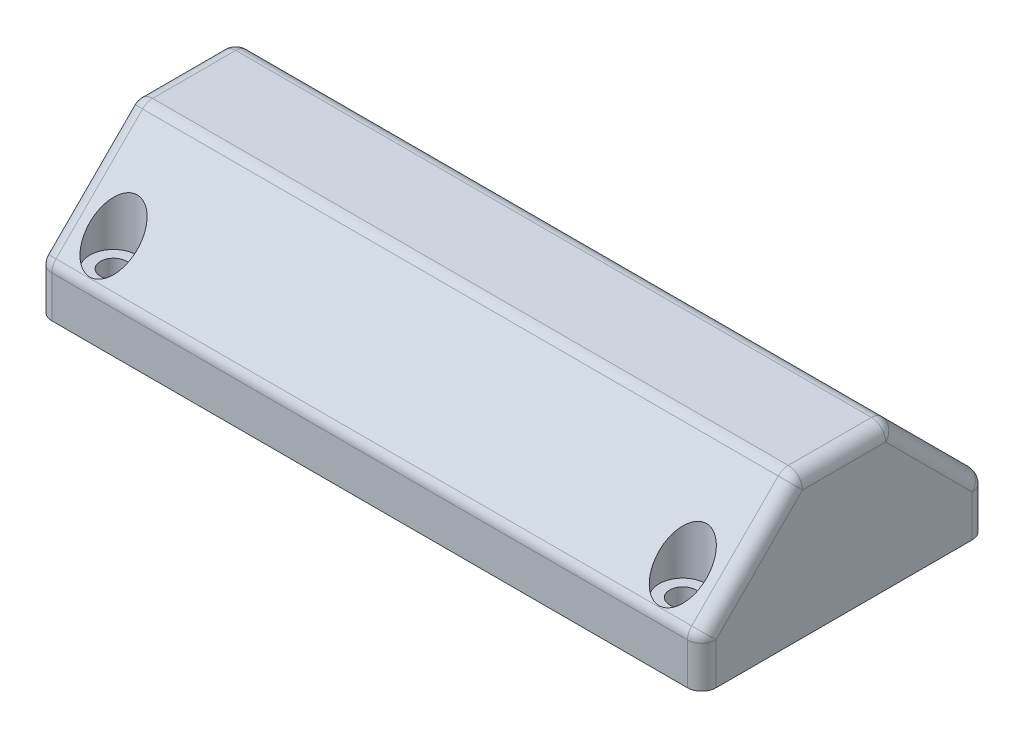
ISO-10303-21;
HEADER;
FILE_DESCRIPTION(('STEP AP214'),'2;1');
FILE_NAME('part.step','',(''),(''),'','','');
FILE_SCHEMA(('AUTOMOTIVE_DESIGN { 1 0 10303 214 1 1 1 1 }'));
ENDSEC;
DATA;
#1=APPLICATION_CONTEXT('core data for automotive mechanical design processes');
#2=APPLICATION_PROTOCOL_DEFINITION('international standard','automotive_design',2000,#1);
#3=PRODUCT_CONTEXT('',#1,'mechanical');
#4=PRODUCT('Part','Part','',(#3));
#5=PRODUCT_RELATED_PRODUCT_CATEGORY('part','',(#4));
#6=PRODUCT_DEFINITION_FORMATION('','',#4);
#7=PRODUCT_DEFINITION_CONTEXT('part definition',#1,'design');
#8=PRODUCT_DEFINITION('design','',#6,#7);
#9=PRODUCT_DEFINITION_SHAPE('','',#8);
#10=(LENGTH_UNIT() NAMED_UNIT(*) SI_UNIT(.MILLI.,.METRE.));
#11=(NAMED_UNIT(*) PLANE_ANGLE_UNIT() SI_UNIT($,.RADIAN.));
#12=(NAMED_UNIT(*) SI_UNIT($,.STERADIAN.) SOLID_ANGLE_UNIT());
#13=UNCERTAINTY_MEASURE_WITH_UNIT(LENGTH_MEASURE(1.E-05),#10,'distance_accuracy_value','');
#14=(GEOMETRIC_REPRESENTATION_CONTEXT(3) GLOBAL_UNCERTAINTY_ASSIGNED_CONTEXT((#13)) GLOBAL_UNIT_ASSIGNED_CONTEXT((#10,
#11,#12)) REPRESENTATION_CONTEXT('',''));
#15=CARTESIAN_POINT('',(0.,0.,0.));
#16=DIRECTION('',(0.,0.,1.));
#17=DIRECTION('',(1.,0.,0.));
#18=AXIS2_PLACEMENT_3D('',#15,#16,#17);
#19=CARTESIAN_POINT('',(70.,10.,0.));
#20=DIRECTION('',(1.,0.,0.));
#21=DIRECTION('',(0.,0.,-1.));
#22=AXIS2_PLACEMENT_3D('',#19,#20,#21);
#23=PLANE('',#22);
#24=DIRECTION('',(0.,-0.707106781186548,0.707106781186548));
#25=VECTOR('',#24,1.);
#26=CARTESIAN_POINT('',(70.,7.87867965644036,27.8786796564403));
#27=LINE('',#26,#25);
#28=CARTESIAN_POINT('',(70.,27.,8.75735931288071));
#29=VERTEX_POINT('',#28);
#30=CARTESIAN_POINT('',(70.,8.75735931288071,27.));
#31=VERTEX_POINT('',#30);
#32=EDGE_CURVE('E211',#29,#31,#27,.T.);
#33=ORIENTED_EDGE('',*,*,#32,.T.);
#34=DIRECTION('',(0.,-1.,0.));
#35=VECTOR('',#34,1.);
#36=CARTESIAN_POINT('',(70.,0.,27.));
#37=LINE('',#36,#35);
#38=CARTESIAN_POINT('',(70.,0.,27.));
#39=VERTEX_POINT('',#38);
#40=EDGE_CURVE('E213',#31,#39,#37,.T.);
#41=ORIENTED_EDGE('',*,*,#40,.T.);
#42=DIRECTION('',(0.,0.,1.));
#43=VECTOR('',#42,1.);
#44=CARTESIAN_POINT('',(70.,0.,0.));
#45=LINE('',#44,#43);
#46=CARTESIAN_POINT('',(70.,0.,-27.));
#47=VERTEX_POINT('',#46);
#48=EDGE_CURVE('E333',#47,#39,#45,.T.);
#49=ORIENTED_EDGE('',*,*,#48,.F.);
#50=DIRECTION('',(0.,-1.,0.));
#51=VECTOR('',#50,1.);
#52=CARTESIAN_POINT('',(70.,9.99999999999999,-27.));
#53=LINE('',#52,#51);
#54=CARTESIAN_POINT('',(70.,8.7573593128807,-27.));
#55=VERTEX_POINT('',#54);
#56=EDGE_CURVE('E205',#47,#55,#53,.F.);
#57=ORIENTED_EDGE('',*,*,#56,.T.);
#58=DIRECTION('',(0.,0.707106781186548,0.707106781186547));
#59=VECTOR('',#58,1.);
#60=CARTESIAN_POINT('',(70.,27.8786796564404,-7.87867965644036));
#61=LINE('',#60,#59);
#62=CARTESIAN_POINT('',(70.,27.,-8.75735931288071));
#63=VERTEX_POINT('',#62);
#64=EDGE_CURVE('E207',#55,#63,#61,.T.);
#65=ORIENTED_EDGE('',*,*,#64,.T.);
#66=DIRECTION('',(0.,0.,-1.));
#67=VECTOR('',#66,1.);
#68=CARTESIAN_POINT('',(70.,27.,0.));
#69=LINE('',#68,#67);
#70=EDGE_CURVE('E209',#63,#29,#69,.F.);
#71=ORIENTED_EDGE('',*,*,#70,.T.);
#72=EDGE_LOOP('',(#33,#41,#49,#57,#65,#71));
#73=FACE_BOUND('',#72,.T.);
#74=ADVANCED_FACE('F37',(#73),#23,.T.);
#75=CARTESIAN_POINT('',(0.,9.99999999999999,-30.));
#76=DIRECTION('',(0.,0.,1.));
#77=DIRECTION('',(0.,-1.,0.));
#78=AXIS2_PLACEMENT_3D('',#75,#76,#77);
#79=PLANE('',#78);
#80=DIRECTION('',(-1.,0.,0.));
#81=VECTOR('',#80,1.);
#82=CARTESIAN_POINT('',(0.,8.7573593128807,-30.));
#83=LINE('',#82,#81);
#84=CARTESIAN_POINT('',(-67.,8.75735931288071,-30.));
#85=VERTEX_POINT('',#84);
#86=CARTESIAN_POINT('',(67.,8.75735931288069,-30.));
#87=VERTEX_POINT('',#86);
#88=EDGE_CURVE('E234',#85,#87,#83,.F.);
#89=ORIENTED_EDGE('',*,*,#88,.T.);
#90=DIRECTION('',(0.,-1.,0.));
#91=VECTOR('',#90,1.);
#92=CARTESIAN_POINT('',(67.,0.,-30.));
#93=LINE('',#92,#91);
#94=CARTESIAN_POINT('',(67.,0.,-30.));
#95=VERTEX_POINT('',#94);
#96=EDGE_CURVE('E236',#87,#95,#93,.T.);
#97=ORIENTED_EDGE('',*,*,#96,.T.);
#98=DIRECTION('',(-1.,0.,0.));
#99=VECTOR('',#98,1.);
#100=CARTESIAN_POINT('',(0.,0.,-30.));
#101=LINE('',#100,#99);
#102=CARTESIAN_POINT('',(-67.,0.,-30.));
#103=VERTEX_POINT('',#102);
#104=EDGE_CURVE('E336',#95,#103,#101,.T.);
#105=ORIENTED_EDGE('',*,*,#104,.T.);
#106=DIRECTION('',(0.,-1.,0.));
#107=VECTOR('',#106,1.);
#108=CARTESIAN_POINT('',(-67.,9.99999999999999,-30.));
#109=LINE('',#108,#107);
#110=EDGE_CURVE('E232',#103,#85,#109,.F.);
#111=ORIENTED_EDGE('',*,*,#110,.T.);
#112=EDGE_LOOP('',(#89,#97,#105,#111));
#113=FACE_BOUND('',#112,.T.);
#114=ADVANCED_FACE('F383',(#113),#79,.F.);
#115=CARTESIAN_POINT('',(-70.,10.,0.));
#116=DIRECTION('',(1.,0.,0.));
#117=DIRECTION('',(0.,0.,-1.));
#118=AXIS2_PLACEMENT_3D('',#115,#116,#117);
#119=PLANE('',#118);
#120=DIRECTION('',(0.,0.,1.));
#121=VECTOR('',#120,1.);
#122=CARTESIAN_POINT('',(-70.,0.,0.));
#123=LINE('',#122,#121);
#124=CARTESIAN_POINT('',(-70.,0.,-27.));
#125=VERTEX_POINT('',#124);
#126=CARTESIAN_POINT('',(-70.,0.,27.));
#127=VERTEX_POINT('',#126);
#128=EDGE_CURVE('E339',#125,#127,#123,.T.);
#129=ORIENTED_EDGE('',*,*,#128,.T.);
#130=DIRECTION('',(0.,-1.,0.));
#131=VECTOR('',#130,1.);
#132=CARTESIAN_POINT('',(-70.,10.,27.));
#133=LINE('',#132,#131);
#134=CARTESIAN_POINT('',(-70.,8.75735931288071,27.));
#135=VERTEX_POINT('',#134);
#136=EDGE_CURVE('E54',#127,#135,#133,.F.);
#137=ORIENTED_EDGE('',*,*,#136,.T.);
#138=DIRECTION('',(0.,-0.707106781186548,0.707106781186548));
#139=VECTOR('',#138,1.);
#140=CARTESIAN_POINT('',(-70.,22.8786796564404,12.8786796564403));
#141=LINE('',#140,#139);
#142=CARTESIAN_POINT('',(-70.,27.,8.75735931288071));
#143=VERTEX_POINT('',#142);
#144=EDGE_CURVE('E58',#135,#143,#141,.F.);
#145=ORIENTED_EDGE('',*,*,#144,.T.);
#146=DIRECTION('',(0.,0.,-1.));
#147=VECTOR('',#146,1.);
#148=CARTESIAN_POINT('',(-70.,27.,-10.));
#149=LINE('',#148,#147);
#150=CARTESIAN_POINT('',(-70.,27.,-8.75735931288071));
#151=VERTEX_POINT('',#150);
#152=EDGE_CURVE('E242',#143,#151,#149,.T.);
#153=ORIENTED_EDGE('',*,*,#152,.T.);
#154=DIRECTION('',(0.,0.707106781186548,0.707106781186547));
#155=VECTOR('',#154,1.);
#156=CARTESIAN_POINT('',(-70.,22.8786796564403,-12.8786796564403));
#157=LINE('',#156,#155);
#158=CARTESIAN_POINT('',(-70.,8.75735931288071,-27.));
#159=VERTEX_POINT('',#158);
#160=EDGE_CURVE('E240',#151,#159,#157,.F.);
#161=ORIENTED_EDGE('',*,*,#160,.T.);
#162=DIRECTION('',(0.,-1.,0.));
#163=VECTOR('',#162,1.);
#164=CARTESIAN_POINT('',(-70.,9.99999999999999,-27.));
#165=LINE('',#164,#163);
#166=EDGE_CURVE('E238',#159,#125,#165,.T.);
#167=ORIENTED_EDGE('',*,*,#166,.T.);
#168=EDGE_LOOP('',(#129,#137,#145,#153,#161,#167));
#169=FACE_BOUND('',#168,.T.);
#170=ADVANCED_FACE('F389',(#169),#119,.F.);
#171=CARTESIAN_POINT('',(60.,10.,24.));
#172=DIRECTION('',(0.,-1.,0.));
#173=DIRECTION('',(0.,0.,-1.));
#174=AXIS2_PLACEMENT_3D('',#171,#172,#173);
#175=CYLINDRICAL_SURFACE('',#174,2.75);
#176=CARTESIAN_POINT('',(60.,10.,24.));
#177=DIRECTION('',(0.,1.,0.));
#178=DIRECTION('',(0.,0.,1.));
#179=AXIS2_PLACEMENT_3D('',#176,#177,#178);
#180=CIRCLE('',#179,2.75);
#181=CARTESIAN_POINT('',(60.,10.,26.75));
#182=VERTEX_POINT('',#181);
#183=EDGE_CURVE('E327',#182,#182,#180,.F.);
#184=ORIENTED_EDGE('',*,*,#183,.F.);
#185=EDGE_LOOP('',(#184));
#186=FACE_BOUND('',#185,.T.);
#187=CARTESIAN_POINT('',(60.,0.,24.));
#188=DIRECTION('',(0.,1.,0.));
#189=DIRECTION('',(0.,0.,1.));
#190=AXIS2_PLACEMENT_3D('',#187,#188,#189);
#191=CIRCLE('',#190,2.75);
#192=CARTESIAN_POINT('',(60.,0.,26.75));
#193=VERTEX_POINT('',#192);
#194=EDGE_CURVE('E189',#193,#193,#191,.F.);
#195=ORIENTED_EDGE('',*,*,#194,.T.);
#196=EDGE_LOOP('',(#195));
#197=FACE_BOUND('',#196,.T.);
#198=ADVANCED_FACE('F534',(#186,#197),#175,.F.);
#199=CARTESIAN_POINT('',(60.,9.99999999999999,-24.));
#200=DIRECTION('',(0.,-1.,0.));
#201=DIRECTION('',(0.,0.,-1.));
#202=AXIS2_PLACEMENT_3D('',#199,#200,#201);
#203=CYLINDRICAL_SURFACE('',#202,2.75);
#204=CARTESIAN_POINT('',(60.,9.99999999999999,-24.));
#205=DIRECTION('',(0.,1.,0.));
#206=DIRECTION('',(0.,0.,1.));
#207=AXIS2_PLACEMENT_3D('',#204,#205,#206);
#208=CIRCLE('',#207,2.75);
#209=CARTESIAN_POINT('',(60.,9.99999999999999,-21.25));
#210=VERTEX_POINT('',#209);
#211=EDGE_CURVE('E324',#210,#210,#208,.F.);
#212=ORIENTED_EDGE('',*,*,#211,.F.);
#213=EDGE_LOOP('',(#212));
#214=FACE_BOUND('',#213,.T.);
#215=CARTESIAN_POINT('',(60.,0.,-24.));
#216=DIRECTION('',(0.,1.,0.));
#217=DIRECTION('',(0.,0.,1.));
#218=AXIS2_PLACEMENT_3D('',#215,#216,#217);
#219=CIRCLE('',#218,2.75);
#220=CARTESIAN_POINT('',(60.,0.,-21.25));
#221=VERTEX_POINT('',#220);
#222=EDGE_CURVE('E347',#221,#221,#219,.F.);
#223=ORIENTED_EDGE('',*,*,#222,.T.);
#224=EDGE_LOOP('',(#223));
#225=FACE_BOUND('',#224,.T.);
#226=ADVANCED_FACE('F529',(#214,#225),#203,.F.);
#227=CARTESIAN_POINT('',(-60.,10.,24.));
#228=DIRECTION('',(0.,-1.,0.));
#229=DIRECTION('',(0.,0.,-1.));
#230=AXIS2_PLACEMENT_3D('',#227,#228,#229);
#231=CYLINDRICAL_SURFACE('',#230,2.75);
#232=CARTESIAN_POINT('',(-60.,10.,24.));
#233=DIRECTION('',(0.,1.,0.));
#234=DIRECTION('',(0.,0.,1.));
#235=AXIS2_PLACEMENT_3D('',#232,#233,#234);
#236=CIRCLE('',#235,2.75);
#237=CARTESIAN_POINT('',(-60.,10.,26.75));
#238=VERTEX_POINT('',#237);
#239=EDGE_CURVE('E321',#238,#238,#236,.F.);
#240=ORIENTED_EDGE('',*,*,#239,.F.);
#241=EDGE_LOOP('',(#240));
#242=FACE_BOUND('',#241,.T.);
#243=CARTESIAN_POINT('',(-60.,0.,24.));
#244=DIRECTION('',(0.,1.,0.));
#245=DIRECTION('',(0.,0.,1.));
#246=AXIS2_PLACEMENT_3D('',#243,#244,#245);
#247=CIRCLE('',#246,2.75);
#248=CARTESIAN_POINT('',(-60.,0.,26.75));
#249=VERTEX_POINT('',#248);
#250=EDGE_CURVE('E344',#249,#249,#247,.F.);
#251=ORIENTED_EDGE('',*,*,#250,.T.);
#252=EDGE_LOOP('',(#251));
#253=FACE_BOUND('',#252,.T.);
#254=ADVANCED_FACE('F521',(#242,#253),#231,.F.);
#255=CARTESIAN_POINT('',(0.,10.,30.));
#256=DIRECTION('',(0.,0.,-1.));
#257=DIRECTION('',(0.,1.,0.));
#258=AXIS2_PLACEMENT_3D('',#255,#256,#257);
#259=PLANE('',#258);
#260=DIRECTION('',(1.,0.,0.));
#261=VECTOR('',#260,1.);
#262=CARTESIAN_POINT('',(0.,0.,30.));
#263=LINE('',#262,#261);
#264=CARTESIAN_POINT('',(-67.,0.,30.));
#265=VERTEX_POINT('',#264);
#266=CARTESIAN_POINT('',(67.,0.,30.));
#267=VERTEX_POINT('',#266);
#268=EDGE_CURVE('E341',#265,#267,#263,.T.);
#269=ORIENTED_EDGE('',*,*,#268,.T.);
#270=DIRECTION('',(0.,-1.,0.));
#271=VECTOR('',#270,1.);
#272=CARTESIAN_POINT('',(67.,10.,30.));
#273=LINE('',#272,#271);
#274=CARTESIAN_POINT('',(67.,8.75735931288071,30.));
#275=VERTEX_POINT('',#274);
#276=EDGE_CURVE('E203',#267,#275,#273,.F.);
#277=ORIENTED_EDGE('',*,*,#276,.T.);
#278=DIRECTION('',(1.,0.,0.));
#279=VECTOR('',#278,1.);
#280=CARTESIAN_POINT('',(0.,8.75735931288071,30.));
#281=LINE('',#280,#279);
#282=CARTESIAN_POINT('',(-67.,8.75735931288071,30.));
#283=VERTEX_POINT('',#282);
#284=EDGE_CURVE('E200',#275,#283,#281,.F.);
#285=ORIENTED_EDGE('',*,*,#284,.T.);
#286=DIRECTION('',(0.,-1.,0.));
#287=VECTOR('',#286,1.);
#288=CARTESIAN_POINT('',(-67.,10.,30.));
#289=LINE('',#288,#287);
#290=EDGE_CURVE('E198',#283,#265,#289,.T.);
#291=ORIENTED_EDGE('',*,*,#290,.T.);
#292=EDGE_LOOP('',(#269,#277,#285,#291));
#293=FACE_BOUND('',#292,.T.);
#294=ADVANCED_FACE('F512',(#293),#259,.F.);
#295=CARTESIAN_POINT('',(-60.,9.99999999999999,-24.));
#296=DIRECTION('',(0.,-1.,0.));
#297=DIRECTION('',(0.,0.,-1.));
#298=AXIS2_PLACEMENT_3D('',#295,#296,#297);
#299=CYLINDRICAL_SURFACE('',#298,2.75);
#300=CARTESIAN_POINT('',(-60.,9.99999999999999,-24.));
#301=DIRECTION('',(0.,1.,0.));
#302=DIRECTION('',(0.,0.,1.));
#303=AXIS2_PLACEMENT_3D('',#300,#301,#302);
#304=CIRCLE('',#303,2.75);
#305=CARTESIAN_POINT('',(-60.,9.99999999999999,-21.25));
#306=VERTEX_POINT('',#305);
#307=EDGE_CURVE('E330',#306,#306,#304,.F.);
#308=ORIENTED_EDGE('',*,*,#307,.F.);
#309=EDGE_LOOP('',(#308));
#310=FACE_BOUND('',#309,.T.);
#311=CARTESIAN_POINT('',(-60.,0.,-24.));
#312=DIRECTION('',(0.,1.,0.));
#313=DIRECTION('',(0.,0.,1.));
#314=AXIS2_PLACEMENT_3D('',#311,#312,#313);
#315=CIRCLE('',#314,2.75);
#316=CARTESIAN_POINT('',(-60.,0.,-21.25));
#317=VERTEX_POINT('',#316);
#318=EDGE_CURVE('E186',#317,#317,#315,.F.);
#319=ORIENTED_EDGE('',*,*,#318,.T.);
#320=EDGE_LOOP('',(#319));
#321=FACE_BOUND('',#320,.T.);
#322=ADVANCED_FACE('F378',(#310,#321),#299,.F.);
#323=CARTESIAN_POINT('',(0.,0.,0.));
#324=DIRECTION('',(0.,1.,0.));
#325=DIRECTION('',(0.,0.,1.));
#326=AXIS2_PLACEMENT_3D('',#323,#324,#325);
#327=PLANE('',#326);
#328=ORIENTED_EDGE('',*,*,#48,.T.);
#329=CARTESIAN_POINT('',(67.,0.,27.));
#330=DIRECTION('',(0.,1.,0.));
#331=DIRECTION('',(0.,0.,1.));
#332=AXIS2_PLACEMENT_3D('',#329,#330,#331);
#333=CIRCLE('',#332,3.);
#334=EDGE_CURVE('E11',#39,#267,#333,.F.);
#335=ORIENTED_EDGE('',*,*,#334,.T.);
#336=ORIENTED_EDGE('',*,*,#268,.F.);
#337=CARTESIAN_POINT('',(-67.,0.,27.));
#338=DIRECTION('',(0.,1.,0.));
#339=DIRECTION('',(0.,0.,1.));
#340=AXIS2_PLACEMENT_3D('',#337,#338,#339);
#341=CIRCLE('',#340,3.);
#342=EDGE_CURVE('E46',#265,#127,#341,.F.);
#343=ORIENTED_EDGE('',*,*,#342,.T.);
#344=ORIENTED_EDGE('',*,*,#128,.F.);
#345=CARTESIAN_POINT('',(-67.,0.,-27.));
#346=DIRECTION('',(0.,1.,0.));
#347=DIRECTION('',(0.,0.,1.));
#348=AXIS2_PLACEMENT_3D('',#345,#346,#347);
#349=CIRCLE('',#348,3.);
#350=EDGE_CURVE('E246',#125,#103,#349,.F.);
#351=ORIENTED_EDGE('',*,*,#350,.T.);
#352=ORIENTED_EDGE('',*,*,#104,.F.);
#353=CARTESIAN_POINT('',(67.,0.,-27.));
#354=DIRECTION('',(0.,1.,0.));
#355=DIRECTION('',(0.,0.,1.));
#356=AXIS2_PLACEMENT_3D('',#353,#354,#355);
#357=CIRCLE('',#356,3.);
#358=EDGE_CURVE('E248',#95,#47,#357,.F.);
#359=ORIENTED_EDGE('',*,*,#358,.T.);
#360=EDGE_LOOP('',(#328,#335,#336,#343,#344,#351,#352,#359));
#361=FACE_BOUND('',#360,.T.);
#362=ORIENTED_EDGE('',*,*,#250,.F.);
#363=EDGE_LOOP('',(#362));
#364=FACE_BOUND('',#363,.T.);
#365=ORIENTED_EDGE('',*,*,#222,.F.);
#366=EDGE_LOOP('',(#365));
#367=FACE_BOUND('',#366,.T.);
#368=ORIENTED_EDGE('',*,*,#194,.F.);
#369=EDGE_LOOP('',(#368));
#370=FACE_BOUND('',#369,.T.);
#371=ORIENTED_EDGE('',*,*,#318,.F.);
#372=EDGE_LOOP('',(#371));
#373=FACE_BOUND('',#372,.T.);
#374=ADVANCED_FACE('F369',(#361,#364,#367,#370,#373),#327,.F.);
#375=CARTESIAN_POINT('',(70.,20.,-20.));
#376=DIRECTION('',(0.,-0.707106781186548,0.707106781186548));
#377=DIRECTION('',(0.,-0.707106781186548,-0.707106781186547));
#378=AXIS2_PLACEMENT_3D('',#375,#376,#377);
#379=PLANE('',#378);
#380=DIRECTION('',(-1.,0.,0.));
#381=VECTOR('',#380,1.);
#382=CARTESIAN_POINT('',(70.,29.1213203435596,-10.8786796564404));
#383=LINE('',#382,#381);
#384=CARTESIAN_POINT('',(-67.,29.1213203435596,-10.8786796564404));
#385=VERTEX_POINT('',#384);
#386=CARTESIAN_POINT('',(67.,29.1213203435596,-10.8786796564404));
#387=VERTEX_POINT('',#386);
#388=EDGE_CURVE('E225',#385,#387,#383,.F.);
#389=ORIENTED_EDGE('',*,*,#388,.T.);
#390=DIRECTION('',(0.,0.707106781186548,0.707106781186547));
#391=VECTOR('',#390,1.);
#392=CARTESIAN_POINT('',(67.,9.99999999999999,-30.));
#393=LINE('',#392,#391);
#394=CARTESIAN_POINT('',(67.,10.8786796564403,-29.1213203435596));
#395=VERTEX_POINT('',#394);
#396=EDGE_CURVE('E229',#387,#395,#393,.F.);
#397=ORIENTED_EDGE('',*,*,#396,.T.);
#398=DIRECTION('',(-1.,0.,0.));
#399=VECTOR('',#398,1.);
#400=CARTESIAN_POINT('',(70.,10.8786796564403,-29.1213203435596));
#401=LINE('',#400,#399);
#402=CARTESIAN_POINT('',(-67.,10.8786796564404,-29.1213203435596));
#403=VERTEX_POINT('',#402);
#404=EDGE_CURVE('E227',#395,#403,#401,.T.);
#405=ORIENTED_EDGE('',*,*,#404,.T.);
#406=DIRECTION('',(0.,0.707106781186548,0.707106781186547));
#407=VECTOR('',#406,1.);
#408=CARTESIAN_POINT('',(-67.,20.,-20.));
#409=LINE('',#408,#407);
#410=EDGE_CURVE('E223',#403,#385,#409,.T.);
#411=ORIENTED_EDGE('',*,*,#410,.T.);
#412=EDGE_LOOP('',(#389,#397,#405,#411));
#413=FACE_BOUND('',#412,.T.);
#414=CARTESIAN_POINT('',(-60.,16.,-24.));
#415=DIRECTION('',(0.,-0.707106781186548,0.707106781186548));
#416=DIRECTION('',(0.,-0.707106781186548,-0.707106781186547));
#417=AXIS2_PLACEMENT_3D('',#414,#415,#416);
#418=ELLIPSE('',#417,7.07106781186547,5.);
#419=CARTESIAN_POINT('',(-60.,11.,-29.));
#420=VERTEX_POINT('',#419);
#421=EDGE_CURVE('E192',#420,#420,#418,.F.);
#422=ORIENTED_EDGE('',*,*,#421,.F.);
#423=EDGE_LOOP('',(#422));
#424=FACE_BOUND('',#423,.T.);
#425=CARTESIAN_POINT('',(60.,16.,-24.));
#426=DIRECTION('',(0.,-0.707106781186548,0.707106781186548));
#427=DIRECTION('',(0.,-0.707106781186548,-0.707106781186547));
#428=AXIS2_PLACEMENT_3D('',#425,#426,#427);
#429=ELLIPSE('',#428,7.07106781186548,5.);
#430=CARTESIAN_POINT('',(60.,11.,-29.));
#431=VERTEX_POINT('',#430);
#432=EDGE_CURVE('E356',#431,#431,#429,.F.);
#433=ORIENTED_EDGE('',*,*,#432,.F.);
#434=EDGE_LOOP('',(#433));
#435=FACE_BOUND('',#434,.T.);
#436=ADVANCED_FACE('F365',(#413,#424,#435),#379,.F.);
#437=CARTESIAN_POINT('',(70.,30.,0.));
#438=DIRECTION('',(0.,1.,0.));
#439=DIRECTION('',(0.,0.,1.));
#440=AXIS2_PLACEMENT_3D('',#437,#438,#439);
#441=PLANE('',#440);
#442=DIRECTION('',(-1.,0.,0.));
#443=VECTOR('',#442,1.);
#444=CARTESIAN_POINT('',(70.,30.,8.75735931288071));
#445=LINE('',#444,#443);
#446=CARTESIAN_POINT('',(-67.,30.,8.75735931288071));
#447=VERTEX_POINT('',#446);
#448=CARTESIAN_POINT('',(67.,30.,8.75735931288071));
#449=VERTEX_POINT('',#448);
#450=EDGE_CURVE('E168',#447,#449,#445,.F.);
#451=ORIENTED_EDGE('',*,*,#450,.T.);
#452=DIRECTION('',(0.,0.,-1.));
#453=VECTOR('',#452,1.);
#454=CARTESIAN_POINT('',(67.,30.,0.));
#455=LINE('',#454,#453);
#456=CARTESIAN_POINT('',(67.,30.,-8.75735931288071));
#457=VERTEX_POINT('',#456);
#458=EDGE_CURVE('E220',#449,#457,#455,.T.);
#459=ORIENTED_EDGE('',*,*,#458,.T.);
#460=DIRECTION('',(-1.,0.,0.));
#461=VECTOR('',#460,1.);
#462=CARTESIAN_POINT('',(-70.,30.,-8.75735931288071));
#463=LINE('',#462,#461);
#464=CARTESIAN_POINT('',(-67.,30.,-8.75735931288071));
#465=VERTEX_POINT('',#464);
#466=EDGE_CURVE('E218',#457,#465,#463,.T.);
#467=ORIENTED_EDGE('',*,*,#466,.T.);
#468=DIRECTION('',(0.,0.,-1.));
#469=VECTOR('',#468,1.);
#470=CARTESIAN_POINT('',(-67.,30.,10.));
#471=LINE('',#470,#469);
#472=EDGE_CURVE('E216',#465,#447,#471,.F.);
#473=ORIENTED_EDGE('',*,*,#472,.T.);
#474=EDGE_LOOP('',(#451,#459,#467,#473));
#475=FACE_BOUND('',#474,.T.);
#476=ADVANCED_FACE('F368',(#475),#441,.T.);
#477=CARTESIAN_POINT('',(70.,20.,20.));
#478=DIRECTION('',(0.,-0.707106781186548,-0.707106781186548));
#479=DIRECTION('',(0.,0.707106781186548,-0.707106781186548));
#480=AXIS2_PLACEMENT_3D('',#477,#478,#479);
#481=PLANE('',#480);
#482=DIRECTION('',(0.,-0.707106781186548,0.707106781186548));
#483=VECTOR('',#482,1.);
#484=CARTESIAN_POINT('',(-67.,20.,20.));
#485=LINE('',#484,#483);
#486=CARTESIAN_POINT('',(-67.,29.1213203435596,10.8786796564404));
#487=VERTEX_POINT('',#486);
#488=CARTESIAN_POINT('',(-67.,10.8786796564404,29.1213203435596));
#489=VERTEX_POINT('',#488);
#490=EDGE_CURVE('E155',#487,#489,#485,.T.);
#491=ORIENTED_EDGE('',*,*,#490,.T.);
#492=DIRECTION('',(1.,0.,0.));
#493=VECTOR('',#492,1.);
#494=CARTESIAN_POINT('',(70.,10.8786796564404,29.1213203435596));
#495=LINE('',#494,#493);
#496=CARTESIAN_POINT('',(67.,10.8786796564404,29.1213203435596));
#497=VERTEX_POINT('',#496);
#498=EDGE_CURVE('E196',#489,#497,#495,.T.);
#499=ORIENTED_EDGE('',*,*,#498,.T.);
#500=DIRECTION('',(0.,-0.707106781186548,0.707106781186548));
#501=VECTOR('',#500,1.);
#502=CARTESIAN_POINT('',(67.,30.,10.));
#503=LINE('',#502,#501);
#504=CARTESIAN_POINT('',(67.,29.1213203435596,10.8786796564404));
#505=VERTEX_POINT('',#504);
#506=EDGE_CURVE('E158',#497,#505,#503,.F.);
#507=ORIENTED_EDGE('',*,*,#506,.T.);
#508=DIRECTION('',(-1.,0.,0.));
#509=VECTOR('',#508,1.);
#510=CARTESIAN_POINT('',(-70.,29.1213203435596,10.8786796564404));
#511=LINE('',#510,#509);
#512=EDGE_CURVE('E149',#505,#487,#511,.T.);
#513=ORIENTED_EDGE('',*,*,#512,.T.);
#514=EDGE_LOOP('',(#491,#499,#507,#513));
#515=FACE_BOUND('',#514,.T.);
#516=CARTESIAN_POINT('',(60.,16.,24.));
#517=DIRECTION('',(0.,-0.707106781186548,-0.707106781186548));
#518=DIRECTION('',(0.,-0.707106781186548,0.707106781186548));
#519=AXIS2_PLACEMENT_3D('',#516,#517,#518);
#520=ELLIPSE('',#519,7.07106781186548,5.);
#521=CARTESIAN_POINT('',(60.,11.,29.));
#522=VERTEX_POINT('',#521);
#523=EDGE_CURVE('E354',#522,#522,#520,.F.);
#524=ORIENTED_EDGE('',*,*,#523,.F.);
#525=EDGE_LOOP('',(#524));
#526=FACE_BOUND('',#525,.T.);
#527=CARTESIAN_POINT('',(-60.,16.,24.));
#528=DIRECTION('',(0.,-0.707106781186548,-0.707106781186548));
#529=DIRECTION('',(0.,-0.707106781186548,0.707106781186548));
#530=AXIS2_PLACEMENT_3D('',#527,#528,#529);
#531=ELLIPSE('',#530,7.07106781186547,5.);
#532=CARTESIAN_POINT('',(-60.,11.,29.));
#533=VERTEX_POINT('',#532);
#534=EDGE_CURVE('E320',#533,#533,#531,.F.);
#535=ORIENTED_EDGE('',*,*,#534,.F.);
#536=EDGE_LOOP('',(#535));
#537=FACE_BOUND('',#536,.T.);
#538=ADVANCED_FACE('F151',(#515,#526,#537),#481,.F.);
#539=CARTESIAN_POINT('',(-60.,10.,24.));
#540=DIRECTION('',(0.,1.,0.));
#541=DIRECTION('',(0.,0.,1.));
#542=AXIS2_PLACEMENT_3D('',#539,#540,#541);
#543=PLANE('',#542);
#544=CARTESIAN_POINT('',(-60.,10.,24.));
#545=DIRECTION('',(0.,1.,0.));
#546=DIRECTION('',(0.,0.,1.));
#547=AXIS2_PLACEMENT_3D('',#544,#545,#546);
#548=CIRCLE('',#547,5.);
#549=CARTESIAN_POINT('',(-60.,10.,29.));
#550=VERTEX_POINT('',#549);
#551=EDGE_CURVE('E304',#550,#550,#548,.T.);
#552=ORIENTED_EDGE('',*,*,#551,.T.);
#553=EDGE_LOOP('',(#552));
#554=FACE_BOUND('',#553,.T.);
#555=ORIENTED_EDGE('',*,*,#239,.T.);
#556=EDGE_LOOP('',(#555));
#557=FACE_BOUND('',#556,.T.);
#558=ADVANCED_FACE('F565',(#554,#557),#543,.T.);
#559=CARTESIAN_POINT('',(-60.,30.,24.));
#560=DIRECTION('',(0.,-1.,0.));
#561=DIRECTION('',(0.,0.,-1.));
#562=AXIS2_PLACEMENT_3D('',#559,#560,#561);
#563=CYLINDRICAL_SURFACE('',#562,5.);
#564=ORIENTED_EDGE('',*,*,#551,.F.);
#565=EDGE_LOOP('',(#564));
#566=FACE_BOUND('',#565,.T.);
#567=ORIENTED_EDGE('',*,*,#534,.T.);
#568=EDGE_LOOP('',(#567));
#569=FACE_BOUND('',#568,.T.);
#570=ADVANCED_FACE('F555',(#566,#569),#563,.F.);
#571=CARTESIAN_POINT('',(60.,10.,24.));
#572=DIRECTION('',(0.,1.,0.));
#573=DIRECTION('',(0.,0.,1.));
#574=AXIS2_PLACEMENT_3D('',#571,#572,#573);
#575=PLANE('',#574);
#576=CARTESIAN_POINT('',(60.,10.,24.));
#577=DIRECTION('',(0.,1.,0.));
#578=DIRECTION('',(0.,0.,1.));
#579=AXIS2_PLACEMENT_3D('',#576,#577,#578);
#580=CIRCLE('',#579,5.);
#581=CARTESIAN_POINT('',(60.,10.,29.));
#582=VERTEX_POINT('',#581);
#583=EDGE_CURVE('E312',#582,#582,#580,.T.);
#584=ORIENTED_EDGE('',*,*,#583,.T.);
#585=EDGE_LOOP('',(#584));
#586=FACE_BOUND('',#585,.T.);
#587=ORIENTED_EDGE('',*,*,#183,.T.);
#588=EDGE_LOOP('',(#587));
#589=FACE_BOUND('',#588,.T.);
#590=ADVANCED_FACE('F552',(#586,#589),#575,.T.);
#591=CARTESIAN_POINT('',(60.,30.,24.));
#592=DIRECTION('',(0.,-1.,0.));
#593=DIRECTION('',(0.,0.,-1.));
#594=AXIS2_PLACEMENT_3D('',#591,#592,#593);
#595=CYLINDRICAL_SURFACE('',#594,5.);
#596=ORIENTED_EDGE('',*,*,#583,.F.);
#597=EDGE_LOOP('',(#596));
#598=FACE_BOUND('',#597,.T.);
#599=ORIENTED_EDGE('',*,*,#523,.T.);
#600=EDGE_LOOP('',(#599));
#601=FACE_BOUND('',#600,.T.);
#602=ADVANCED_FACE('F554',(#598,#601),#595,.F.);
#603=CARTESIAN_POINT('',(60.,9.99999999999999,-24.));
#604=DIRECTION('',(0.,1.,0.));
#605=DIRECTION('',(0.,0.,1.));
#606=AXIS2_PLACEMENT_3D('',#603,#604,#605);
#607=PLANE('',#606);
#608=CARTESIAN_POINT('',(60.,9.99999999999999,-24.));
#609=DIRECTION('',(0.,1.,0.));
#610=DIRECTION('',(0.,0.,1.));
#611=AXIS2_PLACEMENT_3D('',#608,#609,#610);
#612=CIRCLE('',#611,5.);
#613=CARTESIAN_POINT('',(60.,10.,-19.));
#614=VERTEX_POINT('',#613);
#615=EDGE_CURVE('E316',#614,#614,#612,.T.);
#616=ORIENTED_EDGE('',*,*,#615,.T.);
#617=EDGE_LOOP('',(#616));
#618=FACE_BOUND('',#617,.T.);
#619=ORIENTED_EDGE('',*,*,#211,.T.);
#620=EDGE_LOOP('',(#619));
#621=FACE_BOUND('',#620,.T.);
#622=ADVANCED_FACE('F562',(#618,#621),#607,.T.);
#623=CARTESIAN_POINT('',(60.,30.,-24.));
#624=DIRECTION('',(0.,-1.,0.));
#625=DIRECTION('',(0.,0.,-1.));
#626=AXIS2_PLACEMENT_3D('',#623,#624,#625);
#627=CYLINDRICAL_SURFACE('',#626,5.);
#628=ORIENTED_EDGE('',*,*,#615,.F.);
#629=EDGE_LOOP('',(#628));
#630=FACE_BOUND('',#629,.T.);
#631=ORIENTED_EDGE('',*,*,#432,.T.);
#632=EDGE_LOOP('',(#631));
#633=FACE_BOUND('',#632,.T.);
#634=ADVANCED_FACE('F576',(#630,#633),#627,.F.);
#635=CARTESIAN_POINT('',(-60.,9.99999999999999,-24.));
#636=DIRECTION('',(0.,1.,0.));
#637=DIRECTION('',(0.,0.,1.));
#638=AXIS2_PLACEMENT_3D('',#635,#636,#637);
#639=PLANE('',#638);
#640=CARTESIAN_POINT('',(-60.,9.99999999999999,-24.));
#641=DIRECTION('',(0.,1.,0.));
#642=DIRECTION('',(0.,0.,1.));
#643=AXIS2_PLACEMENT_3D('',#640,#641,#642);
#644=CIRCLE('',#643,5.);
#645=CARTESIAN_POINT('',(-60.,10.,-19.));
#646=VERTEX_POINT('',#645);
#647=EDGE_CURVE('E307',#646,#646,#644,.T.);
#648=ORIENTED_EDGE('',*,*,#647,.T.);
#649=EDGE_LOOP('',(#648));
#650=FACE_BOUND('',#649,.T.);
#651=ORIENTED_EDGE('',*,*,#307,.T.);
#652=EDGE_LOOP('',(#651));
#653=FACE_BOUND('',#652,.T.);
#654=ADVANCED_FACE('F572',(#650,#653),#639,.T.);
#655=CARTESIAN_POINT('',(-60.,30.,-24.));
#656=DIRECTION('',(0.,-1.,0.));
#657=DIRECTION('',(0.,0.,-1.));
#658=AXIS2_PLACEMENT_3D('',#655,#656,#657);
#659=CYLINDRICAL_SURFACE('',#658,5.);
#660=ORIENTED_EDGE('',*,*,#647,.F.);
#661=EDGE_LOOP('',(#660));
#662=FACE_BOUND('',#661,.T.);
#663=ORIENTED_EDGE('',*,*,#421,.T.);
#664=EDGE_LOOP('',(#663));
#665=FACE_BOUND('',#664,.T.);
#666=ADVANCED_FACE('F363',(#662,#665),#659,.F.);
#667=CARTESIAN_POINT('',(-67.,9.99999999999999,-27.));
#668=DIRECTION('',(0.,-1.,0.));
#669=DIRECTION('',(0.,0.,-1.));
#670=AXIS2_PLACEMENT_3D('',#667,#668,#669);
#671=CYLINDRICAL_SURFACE('',#670,3.);
#672=ORIENTED_EDGE('',*,*,#350,.F.);
#673=ORIENTED_EDGE('',*,*,#166,.F.);
#674=CARTESIAN_POINT('',(-67.,8.75735931288071,-27.));
#675=DIRECTION('',(0.,1.,0.));
#676=DIRECTION('',(-1.,0.,0.));
#677=AXIS2_PLACEMENT_3D('',#674,#675,#676);
#678=CIRCLE('',#677,3.);
#679=EDGE_CURVE('E41',#85,#159,#678,.T.);
#680=ORIENTED_EDGE('',*,*,#679,.F.);
#681=ORIENTED_EDGE('',*,*,#110,.F.);
#682=EDGE_LOOP('',(#672,#673,#680,#681));
#683=FACE_BOUND('',#682,.T.);
#684=ADVANCED_FACE('F39',(#683),#671,.T.);
#685=CARTESIAN_POINT('',(70.,8.75735931288069,-27.));
#686=DIRECTION('',(-1.,0.,0.));
#687=DIRECTION('',(0.,-1.,0.));
#688=AXIS2_PLACEMENT_3D('',#685,#686,#687);
#689=CYLINDRICAL_SURFACE('',#688,3.);
#690=CARTESIAN_POINT('',(67.,8.75735931288069,-27.));
#691=DIRECTION('',(1.,0.,0.));
#692=DIRECTION('',(0.,0.,-1.));
#693=AXIS2_PLACEMENT_3D('',#690,#691,#692);
#694=CIRCLE('',#693,3.);
#695=EDGE_CURVE('E296',#87,#395,#694,.T.);
#696=ORIENTED_EDGE('',*,*,#695,.F.);
#697=ORIENTED_EDGE('',*,*,#88,.F.);
#698=CARTESIAN_POINT('',(-67.,8.75735931288071,-27.));
#699=DIRECTION('',(-1.,0.,0.));
#700=DIRECTION('',(0.,0.,1.));
#701=AXIS2_PLACEMENT_3D('',#698,#699,#700);
#702=CIRCLE('',#701,3.);
#703=EDGE_CURVE('E298',#403,#85,#702,.T.);
#704=ORIENTED_EDGE('',*,*,#703,.F.);
#705=ORIENTED_EDGE('',*,*,#404,.F.);
#706=EDGE_LOOP('',(#696,#697,#704,#705));
#707=FACE_BOUND('',#706,.T.);
#708=ADVANCED_FACE('F465',(#707),#689,.T.);
#709=CARTESIAN_POINT('',(67.,9.99999999999999,-27.));
#710=DIRECTION('',(0.,1.,0.));
#711=DIRECTION('',(0.,0.,1.));
#712=AXIS2_PLACEMENT_3D('',#709,#710,#711);
#713=CYLINDRICAL_SURFACE('',#712,3.);
#714=ORIENTED_EDGE('',*,*,#358,.F.);
#715=ORIENTED_EDGE('',*,*,#96,.F.);
#716=CARTESIAN_POINT('',(67.,8.7573593128807,-27.));
#717=DIRECTION('',(0.,1.,0.));
#718=DIRECTION('',(0.,0.,1.));
#719=AXIS2_PLACEMENT_3D('',#716,#717,#718);
#720=CIRCLE('',#719,3.);
#721=EDGE_CURVE('E293',#55,#87,#720,.T.);
#722=ORIENTED_EDGE('',*,*,#721,.F.);
#723=ORIENTED_EDGE('',*,*,#56,.F.);
#724=EDGE_LOOP('',(#714,#715,#722,#723));
#725=FACE_BOUND('',#724,.T.);
#726=ADVANCED_FACE('F463',(#725),#713,.T.);
#727=CARTESIAN_POINT('',(-67.,8.75735931288071,-27.));
#728=DIRECTION('',(-1.,0.,0.));
#729=DIRECTION('',(0.,-1.,0.));
#730=AXIS2_PLACEMENT_3D('',#727,#728,#729);
#731=SPHERICAL_SURFACE('',#730,3.);
#732=ORIENTED_EDGE('',*,*,#703,.T.);
#733=ORIENTED_EDGE('',*,*,#679,.T.);
#734=CARTESIAN_POINT('',(-67.,8.75735931288071,-27.));
#735=DIRECTION('',(0.,-0.707106781186548,-0.707106781186547));
#736=DIRECTION('',(0.,0.707106781186547,-0.707106781186548));
#737=AXIS2_PLACEMENT_3D('',#734,#735,#736);
#738=CIRCLE('',#737,3.);
#739=EDGE_CURVE('E290',#403,#159,#738,.F.);
#740=ORIENTED_EDGE('',*,*,#739,.F.);
#741=EDGE_LOOP('',(#732,#733,#740));
#742=FACE_BOUND('',#741,.T.);
#743=ADVANCED_FACE('F459',(#742),#731,.T.);
#744=CARTESIAN_POINT('',(67.,8.75735931288069,-27.));
#745=DIRECTION('',(1.,0.,0.));
#746=DIRECTION('',(0.,1.,0.));
#747=AXIS2_PLACEMENT_3D('',#744,#745,#746);
#748=SPHERICAL_SURFACE('',#747,3.);
#749=ORIENTED_EDGE('',*,*,#721,.T.);
#750=ORIENTED_EDGE('',*,*,#695,.T.);
#751=CARTESIAN_POINT('',(67.,8.75735931288069,-27.));
#752=DIRECTION('',(0.,-0.707106781186548,-0.707106781186548));
#753=DIRECTION('',(0.,0.707106781186548,-0.707106781186548));
#754=AXIS2_PLACEMENT_3D('',#751,#752,#753);
#755=CIRCLE('',#754,3.);
#756=EDGE_CURVE('E288',#55,#395,#755,.F.);
#757=ORIENTED_EDGE('',*,*,#756,.F.);
#758=EDGE_LOOP('',(#749,#750,#757));
#759=FACE_BOUND('',#758,.T.);
#760=ADVANCED_FACE('F455',(#759),#748,.T.);
#761=CARTESIAN_POINT('',(-67.,17.8786796564403,-17.8786796564404));
#762=DIRECTION('',(0.,0.707106781186548,0.707106781186547));
#763=DIRECTION('',(0.,-0.707106781186547,0.707106781186548));
#764=AXIS2_PLACEMENT_3D('',#761,#762,#763);
#765=CYLINDRICAL_SURFACE('',#764,3.);
#766=ORIENTED_EDGE('',*,*,#739,.T.);
#767=ORIENTED_EDGE('',*,*,#160,.F.);
#768=CARTESIAN_POINT('',(-67.,27.,-8.75735931288071));
#769=DIRECTION('',(0.,0.707106781186548,0.707106781186547));
#770=DIRECTION('',(0.,-0.707106781186547,0.707106781186548));
#771=AXIS2_PLACEMENT_3D('',#768,#769,#770);
#772=CIRCLE('',#771,3.);
#773=EDGE_CURVE('E285',#385,#151,#772,.T.);
#774=ORIENTED_EDGE('',*,*,#773,.F.);
#775=ORIENTED_EDGE('',*,*,#410,.F.);
#776=EDGE_LOOP('',(#766,#767,#774,#775));
#777=FACE_BOUND('',#776,.T.);
#778=ADVANCED_FACE('F451',(#777),#765,.T.);
#779=CARTESIAN_POINT('',(70.,27.,-8.75735931288071));
#780=DIRECTION('',(1.,0.,0.));
#781=DIRECTION('',(0.,0.,-1.));
#782=AXIS2_PLACEMENT_3D('',#779,#780,#781);
#783=CYLINDRICAL_SURFACE('',#782,3.);
#784=CARTESIAN_POINT('',(67.,27.,-8.75735931288071));
#785=DIRECTION('',(1.,0.,0.));
#786=DIRECTION('',(0.,0.,-1.));
#787=AXIS2_PLACEMENT_3D('',#784,#785,#786);
#788=CIRCLE('',#787,3.);
#789=EDGE_CURVE('E279',#387,#457,#788,.T.);
#790=ORIENTED_EDGE('',*,*,#789,.F.);
#791=ORIENTED_EDGE('',*,*,#388,.F.);
#792=CARTESIAN_POINT('',(-67.,27.,-8.75735931288071));
#793=DIRECTION('',(-1.,0.,0.));
#794=DIRECTION('',(0.,0.,1.));
#795=AXIS2_PLACEMENT_3D('',#792,#793,#794);
#796=CIRCLE('',#795,3.);
#797=EDGE_CURVE('E282',#465,#385,#796,.T.);
#798=ORIENTED_EDGE('',*,*,#797,.F.);
#799=ORIENTED_EDGE('',*,*,#466,.F.);
#800=EDGE_LOOP('',(#790,#791,#798,#799));
#801=FACE_BOUND('',#800,.T.);
#802=ADVANCED_FACE('F447',(#801),#783,.T.);
#803=CARTESIAN_POINT('',(67.,22.8786796564403,-12.8786796564404));
#804=DIRECTION('',(0.,-0.707106781186548,-0.707106781186547));
#805=DIRECTION('',(0.,0.707106781186547,-0.707106781186548));
#806=AXIS2_PLACEMENT_3D('',#803,#804,#805);
#807=CYLINDRICAL_SURFACE('',#806,3.);
#808=ORIENTED_EDGE('',*,*,#756,.T.);
#809=ORIENTED_EDGE('',*,*,#396,.F.);
#810=CARTESIAN_POINT('',(67.,27.,-8.75735931288071));
#811=DIRECTION('',(0.,0.707106781186547,0.707106781186548));
#812=DIRECTION('',(0.,-0.707106781186548,0.707106781186547));
#813=AXIS2_PLACEMENT_3D('',#810,#811,#812);
#814=CIRCLE('',#813,3.);
#815=EDGE_CURVE('E276',#63,#387,#814,.T.);
#816=ORIENTED_EDGE('',*,*,#815,.F.);
#817=ORIENTED_EDGE('',*,*,#64,.F.);
#818=EDGE_LOOP('',(#808,#809,#816,#817));
#819=FACE_BOUND('',#818,.T.);
#820=ADVANCED_FACE('F443',(#819),#807,.T.);
#821=CARTESIAN_POINT('',(-67.,27.,-8.75735931288071));
#822=DIRECTION('',(-1.,0.,0.));
#823=DIRECTION('',(0.,0.,1.));
#824=AXIS2_PLACEMENT_3D('',#821,#822,#823);
#825=SPHERICAL_SURFACE('',#824,3.);
#826=ORIENTED_EDGE('',*,*,#797,.T.);
#827=ORIENTED_EDGE('',*,*,#773,.T.);
#828=CARTESIAN_POINT('',(-67.,27.,-8.75735931288071));
#829=DIRECTION('',(0.,0.,-1.));
#830=DIRECTION('',(0.,1.,0.));
#831=AXIS2_PLACEMENT_3D('',#828,#829,#830);
#832=CIRCLE('',#831,3.);
#833=EDGE_CURVE('E273',#465,#151,#832,.F.);
#834=ORIENTED_EDGE('',*,*,#833,.F.);
#835=EDGE_LOOP('',(#826,#827,#834));
#836=FACE_BOUND('',#835,.T.);
#837=ADVANCED_FACE('F439',(#836),#825,.T.);
#838=CARTESIAN_POINT('',(67.,27.,-8.75735931288071));
#839=DIRECTION('',(1.,0.,0.));
#840=DIRECTION('',(0.,0.,-1.));
#841=AXIS2_PLACEMENT_3D('',#838,#839,#840);
#842=SPHERICAL_SURFACE('',#841,3.);
#843=ORIENTED_EDGE('',*,*,#815,.T.);
#844=ORIENTED_EDGE('',*,*,#789,.T.);
#845=CARTESIAN_POINT('',(67.,27.,-8.75735931288071));
#846=DIRECTION('',(0.,0.,-1.));
#847=DIRECTION('',(-1.,0.,0.));
#848=AXIS2_PLACEMENT_3D('',#845,#846,#847);
#849=CIRCLE('',#848,3.);
#850=EDGE_CURVE('E271',#63,#457,#849,.F.);
#851=ORIENTED_EDGE('',*,*,#850,.F.);
#852=EDGE_LOOP('',(#843,#844,#851));
#853=FACE_BOUND('',#852,.T.);
#854=ADVANCED_FACE('F435',(#853),#842,.T.);
#855=CARTESIAN_POINT('',(-67.,27.,0.));
#856=DIRECTION('',(0.,0.,1.));
#857=DIRECTION('',(1.,0.,0.));
#858=AXIS2_PLACEMENT_3D('',#855,#856,#857);
#859=CYLINDRICAL_SURFACE('',#858,3.);
#860=ORIENTED_EDGE('',*,*,#833,.T.);
#861=ORIENTED_EDGE('',*,*,#152,.F.);
#862=CARTESIAN_POINT('',(-67.,27.,8.75735931288071));
#863=DIRECTION('',(0.,0.,1.));
#864=DIRECTION('',(1.,0.,0.));
#865=AXIS2_PLACEMENT_3D('',#862,#863,#864);
#866=CIRCLE('',#865,3.);
#867=EDGE_CURVE('E172',#447,#143,#866,.T.);
#868=ORIENTED_EDGE('',*,*,#867,.F.);
#869=ORIENTED_EDGE('',*,*,#472,.F.);
#870=EDGE_LOOP('',(#860,#861,#868,#869));
#871=FACE_BOUND('',#870,.T.);
#872=ADVANCED_FACE('F432',(#871),#859,.T.);
#873=CARTESIAN_POINT('',(70.,27.,8.75735931288071));
#874=DIRECTION('',(1.,0.,0.));
#875=DIRECTION('',(0.,0.,-1.));
#876=AXIS2_PLACEMENT_3D('',#873,#874,#875);
#877=CYLINDRICAL_SURFACE('',#876,3.);
#878=CARTESIAN_POINT('',(67.,27.,8.75735931288071));
#879=DIRECTION('',(1.,0.,0.));
#880=DIRECTION('',(0.,0.,-1.));
#881=AXIS2_PLACEMENT_3D('',#878,#879,#880);
#882=CIRCLE('',#881,3.);
#883=EDGE_CURVE('E173',#449,#505,#882,.T.);
#884=ORIENTED_EDGE('',*,*,#883,.F.);
#885=ORIENTED_EDGE('',*,*,#450,.F.);
#886=CARTESIAN_POINT('',(-67.,27.,8.75735931288071));
#887=DIRECTION('',(-1.,0.,0.));
#888=DIRECTION('',(0.,0.,1.));
#889=AXIS2_PLACEMENT_3D('',#886,#887,#888);
#890=CIRCLE('',#889,3.);
#891=EDGE_CURVE('E165',#487,#447,#890,.T.);
#892=ORIENTED_EDGE('',*,*,#891,.F.);
#893=ORIENTED_EDGE('',*,*,#512,.F.);
#894=EDGE_LOOP('',(#884,#885,#892,#893));
#895=FACE_BOUND('',#894,.T.);
#896=ADVANCED_FACE('F167',(#895),#877,.T.);
#897=CARTESIAN_POINT('',(67.,27.,0.));
#898=DIRECTION('',(0.,0.,-1.));
#899=DIRECTION('',(-1.,0.,0.));
#900=AXIS2_PLACEMENT_3D('',#897,#898,#899);
#901=CYLINDRICAL_SURFACE('',#900,3.);
#902=ORIENTED_EDGE('',*,*,#850,.T.);
#903=ORIENTED_EDGE('',*,*,#458,.F.);
#904=CARTESIAN_POINT('',(67.,27.,8.75735931288071));
#905=DIRECTION('',(0.,0.,1.));
#906=DIRECTION('',(1.,0.,0.));
#907=AXIS2_PLACEMENT_3D('',#904,#905,#906);
#908=CIRCLE('',#907,3.);
#909=EDGE_CURVE('E179',#29,#449,#908,.T.);
#910=ORIENTED_EDGE('',*,*,#909,.F.);
#911=ORIENTED_EDGE('',*,*,#70,.F.);
#912=EDGE_LOOP('',(#902,#903,#910,#911));
#913=FACE_BOUND('',#912,.T.);
#914=ADVANCED_FACE('F426',(#913),#901,.T.);
#915=CARTESIAN_POINT('',(-67.,27.,8.75735931288071));
#916=DIRECTION('',(-1.,0.,0.));
#917=DIRECTION('',(0.,-1.,0.));
#918=AXIS2_PLACEMENT_3D('',#915,#916,#917);
#919=SPHERICAL_SURFACE('',#918,3.);
#920=ORIENTED_EDGE('',*,*,#891,.T.);
#921=ORIENTED_EDGE('',*,*,#867,.T.);
#922=CARTESIAN_POINT('',(-67.,27.,8.75735931288071));
#923=DIRECTION('',(0.,0.707106781186548,-0.707106781186547));
#924=DIRECTION('',(0.,0.707106781186547,0.707106781186548));
#925=AXIS2_PLACEMENT_3D('',#922,#923,#924);
#926=CIRCLE('',#925,3.);
#927=EDGE_CURVE('E176',#487,#143,#926,.F.);
#928=ORIENTED_EDGE('',*,*,#927,.F.);
#929=EDGE_LOOP('',(#920,#921,#928));
#930=FACE_BOUND('',#929,.T.);
#931=ADVANCED_FACE('F177',(#930),#919,.T.);
#932=CARTESIAN_POINT('',(67.,27.,8.75735931288071));
#933=DIRECTION('',(1.,0.,0.));
#934=DIRECTION('',(0.,0.,-1.));
#935=AXIS2_PLACEMENT_3D('',#932,#933,#934);
#936=SPHERICAL_SURFACE('',#935,3.);
#937=ORIENTED_EDGE('',*,*,#909,.T.);
#938=ORIENTED_EDGE('',*,*,#883,.T.);
#939=CARTESIAN_POINT('',(67.,27.,8.75735931288071));
#940=DIRECTION('',(0.,0.707106781186548,-0.707106781186548));
#941=DIRECTION('',(0.,0.707106781186548,0.707106781186548));
#942=AXIS2_PLACEMENT_3D('',#939,#940,#941);
#943=CIRCLE('',#942,3.);
#944=EDGE_CURVE('E180',#29,#505,#943,.F.);
#945=ORIENTED_EDGE('',*,*,#944,.F.);
#946=EDGE_LOOP('',(#937,#938,#945));
#947=FACE_BOUND('',#946,.T.);
#948=ADVANCED_FACE('F419',(#947),#936,.T.);
#949=CARTESIAN_POINT('',(-67.,10.,27.));
#950=DIRECTION('',(0.,-1.,0.));
#951=DIRECTION('',(0.,0.,-1.));
#952=AXIS2_PLACEMENT_3D('',#949,#950,#951);
#953=CYLINDRICAL_SURFACE('',#952,3.);
#954=ORIENTED_EDGE('',*,*,#342,.F.);
#955=ORIENTED_EDGE('',*,*,#290,.F.);
#956=CARTESIAN_POINT('',(-67.,8.75735931288071,27.));
#957=DIRECTION('',(0.,1.,0.));
#958=DIRECTION('',(0.,0.,1.));
#959=AXIS2_PLACEMENT_3D('',#956,#957,#958);
#960=CIRCLE('',#959,3.);
#961=EDGE_CURVE('E262',#135,#283,#960,.T.);
#962=ORIENTED_EDGE('',*,*,#961,.F.);
#963=ORIENTED_EDGE('',*,*,#136,.F.);
#964=EDGE_LOOP('',(#954,#955,#962,#963));
#965=FACE_BOUND('',#964,.T.);
#966=ADVANCED_FACE('F416',(#965),#953,.T.);
#967=CARTESIAN_POINT('',(-67.,17.8786796564404,17.8786796564404));
#968=DIRECTION('',(0.,-0.707106781186548,0.707106781186548));
#969=DIRECTION('',(0.,-0.707106781186548,-0.707106781186548));
#970=AXIS2_PLACEMENT_3D('',#967,#968,#969);
#971=CYLINDRICAL_SURFACE('',#970,3.);
#972=ORIENTED_EDGE('',*,*,#927,.T.);
#973=ORIENTED_EDGE('',*,*,#144,.F.);
#974=CARTESIAN_POINT('',(-67.,8.75735931288071,27.));
#975=DIRECTION('',(0.,-0.707106781186548,0.707106781186548));
#976=DIRECTION('',(0.,-0.707106781186548,-0.707106781186548));
#977=AXIS2_PLACEMENT_3D('',#974,#975,#976);
#978=CIRCLE('',#977,3.);
#979=EDGE_CURVE('E184',#489,#135,#978,.T.);
#980=ORIENTED_EDGE('',*,*,#979,.F.);
#981=ORIENTED_EDGE('',*,*,#490,.F.);
#982=EDGE_LOOP('',(#972,#973,#980,#981));
#983=FACE_BOUND('',#982,.T.);
#984=ADVANCED_FACE('F182',(#983),#971,.T.);
#985=CARTESIAN_POINT('',(67.,22.8786796564404,12.8786796564403));
#986=DIRECTION('',(0.,0.707106781186548,-0.707106781186548));
#987=DIRECTION('',(0.,0.707106781186548,0.707106781186548));
#988=AXIS2_PLACEMENT_3D('',#985,#986,#987);
#989=CYLINDRICAL_SURFACE('',#988,3.);
#990=ORIENTED_EDGE('',*,*,#944,.T.);
#991=ORIENTED_EDGE('',*,*,#506,.F.);
#992=CARTESIAN_POINT('',(67.,8.75735931288071,27.));
#993=DIRECTION('',(0.,-0.707106781186547,0.707106781186548));
#994=DIRECTION('',(0.,-0.707106781186548,-0.707106781186547));
#995=AXIS2_PLACEMENT_3D('',#992,#993,#994);
#996=CIRCLE('',#995,3.);
#997=EDGE_CURVE('E258',#31,#497,#996,.T.);
#998=ORIENTED_EDGE('',*,*,#997,.F.);
#999=ORIENTED_EDGE('',*,*,#32,.F.);
#1000=EDGE_LOOP('',(#990,#991,#998,#999));
#1001=FACE_BOUND('',#1000,.T.);
#1002=ADVANCED_FACE('F409',(#1001),#989,.T.);
#1003=CARTESIAN_POINT('',(67.,10.,27.));
#1004=DIRECTION('',(0.,1.,0.));
#1005=DIRECTION('',(0.,0.,1.));
#1006=AXIS2_PLACEMENT_3D('',#1003,#1004,#1005);
#1007=CYLINDRICAL_SURFACE('',#1006,3.);
#1008=ORIENTED_EDGE('',*,*,#334,.F.);
#1009=ORIENTED_EDGE('',*,*,#40,.F.);
#1010=CARTESIAN_POINT('',(67.,8.75735931288071,27.));
#1011=DIRECTION('',(0.,1.,0.));
#1012=DIRECTION('',(-1.,0.,0.));
#1013=AXIS2_PLACEMENT_3D('',#1010,#1011,#1012);
#1014=CIRCLE('',#1013,3.);
#1015=EDGE_CURVE('E255',#275,#31,#1014,.T.);
#1016=ORIENTED_EDGE('',*,*,#1015,.F.);
#1017=ORIENTED_EDGE('',*,*,#276,.F.);
#1018=EDGE_LOOP('',(#1008,#1009,#1016,#1017));
#1019=FACE_BOUND('',#1018,.T.);
#1020=ADVANCED_FACE('F405',(#1019),#1007,.T.);
#1021=CARTESIAN_POINT('',(-67.,8.75735931288071,27.));
#1022=DIRECTION('',(-1.,0.,0.));
#1023=DIRECTION('',(0.,-1.,0.));
#1024=AXIS2_PLACEMENT_3D('',#1021,#1022,#1023);
#1025=SPHERICAL_SURFACE('',#1024,3.);
#1026=ORIENTED_EDGE('',*,*,#979,.T.);
#1027=ORIENTED_EDGE('',*,*,#961,.T.);
#1028=CARTESIAN_POINT('',(-67.,8.75735931288071,27.));
#1029=DIRECTION('',(-1.,0.,0.));
#1030=DIRECTION('',(0.,0.,1.));
#1031=AXIS2_PLACEMENT_3D('',#1028,#1029,#1030);
#1032=CIRCLE('',#1031,3.);
#1033=EDGE_CURVE('E253',#489,#283,#1032,.F.);
#1034=ORIENTED_EDGE('',*,*,#1033,.F.);
#1035=EDGE_LOOP('',(#1026,#1027,#1034));
#1036=FACE_BOUND('',#1035,.T.);
#1037=ADVANCED_FACE('F401',(#1036),#1025,.T.);
#1038=CARTESIAN_POINT('',(67.,8.75735931288071,27.));
#1039=DIRECTION('',(1.,0.,0.));
#1040=DIRECTION('',(0.,1.,0.));
#1041=AXIS2_PLACEMENT_3D('',#1038,#1039,#1040);
#1042=SPHERICAL_SURFACE('',#1041,3.);
#1043=ORIENTED_EDGE('',*,*,#1015,.T.);
#1044=ORIENTED_EDGE('',*,*,#997,.T.);
#1045=CARTESIAN_POINT('',(67.,8.75735931288071,27.));
#1046=DIRECTION('',(1.,0.,0.));
#1047=DIRECTION('',(0.,0.,-1.));
#1048=AXIS2_PLACEMENT_3D('',#1045,#1046,#1047);
#1049=CIRCLE('',#1048,3.);
#1050=EDGE_CURVE('E251',#275,#497,#1049,.F.);
#1051=ORIENTED_EDGE('',*,*,#1050,.F.);
#1052=EDGE_LOOP('',(#1043,#1044,#1051));
#1053=FACE_BOUND('',#1052,.T.);
#1054=ADVANCED_FACE('F397',(#1053),#1042,.T.);
#1055=CARTESIAN_POINT('',(70.,8.75735931288071,27.));
#1056=DIRECTION('',(1.,0.,0.));
#1057=DIRECTION('',(0.,0.,-1.));
#1058=AXIS2_PLACEMENT_3D('',#1055,#1056,#1057);
#1059=CYLINDRICAL_SURFACE('',#1058,3.);
#1060=ORIENTED_EDGE('',*,*,#1033,.T.);
#1061=ORIENTED_EDGE('',*,*,#284,.F.);
#1062=ORIENTED_EDGE('',*,*,#1050,.T.);
#1063=ORIENTED_EDGE('',*,*,#498,.F.);
#1064=EDGE_LOOP('',(#1060,#1061,#1062,#1063));
#1065=FACE_BOUND('',#1064,.T.);
#1066=ADVANCED_FACE('F394',(#1065),#1059,.T.);
#1067=CLOSED_SHELL('',(#74,#114,#170,#198,#226,#254,#294,#322,#374,#436,#476,#538,#558,#570,
#590,#602,#622,#634,#654,#666,#684,#708,#726,#743,#760,#778,#802,#820,#837,#854,#872,#896,#914,
#931,#948,#966,#984,#1002,#1020,#1037,#1054,#1066));
#1068=MANIFOLD_SOLID_BREP('B2',#1067);
#1069=ADVANCED_BREP_SHAPE_REPRESENTATION('',(#18,#1068),#14);
#1070=SHAPE_DEFINITION_REPRESENTATION(#9,#1069);
ENDSEC;
END-ISO-10303-21;
